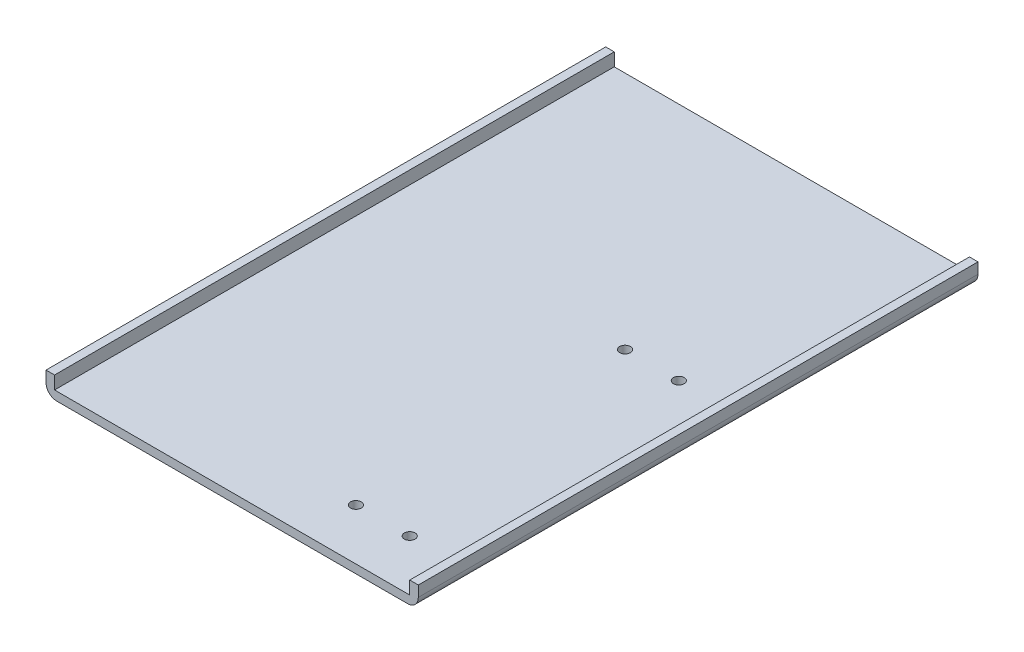
ISO-10303-21;
HEADER;
FILE_DESCRIPTION(('STEP AP214'),'2;1');
FILE_NAME('part.step','',(''),(''),'','','');
FILE_SCHEMA(('AUTOMOTIVE_DESIGN { 1 0 10303 214 1 1 1 1 }'));
ENDSEC;
DATA;
#1=APPLICATION_CONTEXT('core data for automotive mechanical design processes');
#2=APPLICATION_PROTOCOL_DEFINITION('international standard','automotive_design',2000,#1);
#3=PRODUCT_CONTEXT('',#1,'mechanical');
#4=PRODUCT('Part','Part','',(#3));
#5=PRODUCT_RELATED_PRODUCT_CATEGORY('part','',(#4));
#6=PRODUCT_DEFINITION_FORMATION('','',#4);
#7=PRODUCT_DEFINITION_CONTEXT('part definition',#1,'design');
#8=PRODUCT_DEFINITION('design','',#6,#7);
#9=PRODUCT_DEFINITION_SHAPE('','',#8);
#10=(LENGTH_UNIT() NAMED_UNIT(*) SI_UNIT(.MILLI.,.METRE.));
#11=(NAMED_UNIT(*) PLANE_ANGLE_UNIT() SI_UNIT($,.RADIAN.));
#12=(NAMED_UNIT(*) SI_UNIT($,.STERADIAN.) SOLID_ANGLE_UNIT());
#13=UNCERTAINTY_MEASURE_WITH_UNIT(LENGTH_MEASURE(1.E-05),#10,'distance_accuracy_value','');
#14=(GEOMETRIC_REPRESENTATION_CONTEXT(3) GLOBAL_UNCERTAINTY_ASSIGNED_CONTEXT((#13)) GLOBAL_UNIT_ASSIGNED_CONTEXT((#10,
#11,#12)) REPRESENTATION_CONTEXT('',''));
#15=CARTESIAN_POINT('',(0.,0.,0.));
#16=DIRECTION('',(0.,0.,1.));
#17=DIRECTION('',(1.,0.,0.));
#18=AXIS2_PLACEMENT_3D('',#15,#16,#17);
#19=CARTESIAN_POINT('',(-32.5875,2.,0.));
#20=DIRECTION('',(0.,0.,-1.));
#21=DIRECTION('',(-1.,0.,0.));
#22=AXIS2_PLACEMENT_3D('',#19,#20,#21);
#23=CYLINDRICAL_SURFACE('',#22,2.);
#24=DIRECTION('',(0.,0.,1.));
#25=VECTOR('',#24,1.);
#26=CARTESIAN_POINT('',(-34.5875,2.,0.));
#27=LINE('',#26,#25);
#28=CARTESIAN_POINT('',(-34.5875,2.,-52.));
#29=VERTEX_POINT('',#28);
#30=CARTESIAN_POINT('',(-34.5875,2.,52.));
#31=VERTEX_POINT('',#30);
#32=EDGE_CURVE('E213',#29,#31,#27,.T.);
#33=ORIENTED_EDGE('',*,*,#32,.F.);
#34=CARTESIAN_POINT('',(-32.5875,2.,-52.));
#35=DIRECTION('',(0.,0.,1.));
#36=DIRECTION('',(1.,0.,0.));
#37=AXIS2_PLACEMENT_3D('',#34,#35,#36);
#38=CIRCLE('',#37,2.);
#39=CARTESIAN_POINT('',(-32.5875,0.,-52.));
#40=VERTEX_POINT('',#39);
#41=EDGE_CURVE('E39',#40,#29,#38,.F.);
#42=ORIENTED_EDGE('',*,*,#41,.F.);
#43=DIRECTION('',(0.,0.,1.));
#44=VECTOR('',#43,1.);
#45=CARTESIAN_POINT('',(-32.5875,0.,0.));
#46=LINE('',#45,#44);
#47=CARTESIAN_POINT('',(-32.5875,0.,52.));
#48=VERTEX_POINT('',#47);
#49=EDGE_CURVE('E216',#48,#40,#46,.F.);
#50=ORIENTED_EDGE('',*,*,#49,.F.);
#51=CARTESIAN_POINT('',(-32.5875,2.,52.));
#52=DIRECTION('',(0.,0.,-1.));
#53=DIRECTION('',(-1.,0.,0.));
#54=AXIS2_PLACEMENT_3D('',#51,#52,#53);
#55=CIRCLE('',#54,2.);
#56=EDGE_CURVE('E11',#31,#48,#55,.F.);
#57=ORIENTED_EDGE('',*,*,#56,.F.);
#58=EDGE_LOOP('',(#33,#42,#50,#57));
#59=FACE_BOUND('',#58,.T.);
#60=ADVANCED_FACE('F32',(#59),#23,.T.);
#61=CARTESIAN_POINT('',(32.5875,2.,0.));
#62=DIRECTION('',(0.,0.,-1.));
#63=DIRECTION('',(-1.,0.,0.));
#64=AXIS2_PLACEMENT_3D('',#61,#62,#63);
#65=CYLINDRICAL_SURFACE('',#64,2.);
#66=DIRECTION('',(0.,0.,1.));
#67=VECTOR('',#66,1.);
#68=CARTESIAN_POINT('',(32.5875,0.,0.));
#69=LINE('',#68,#67);
#70=CARTESIAN_POINT('',(32.5875,0.,-52.));
#71=VERTEX_POINT('',#70);
#72=CARTESIAN_POINT('',(32.5875,0.,52.));
#73=VERTEX_POINT('',#72);
#74=EDGE_CURVE('E193',#71,#73,#69,.T.);
#75=ORIENTED_EDGE('',*,*,#74,.F.);
#76=CARTESIAN_POINT('',(32.5875,2.,-52.));
#77=DIRECTION('',(0.,0.,1.));
#78=DIRECTION('',(1.,0.,0.));
#79=AXIS2_PLACEMENT_3D('',#76,#77,#78);
#80=CIRCLE('',#79,2.);
#81=CARTESIAN_POINT('',(34.5875,2.,-52.));
#82=VERTEX_POINT('',#81);
#83=EDGE_CURVE('E209',#82,#71,#80,.F.);
#84=ORIENTED_EDGE('',*,*,#83,.F.);
#85=DIRECTION('',(0.,0.,1.));
#86=VECTOR('',#85,1.);
#87=CARTESIAN_POINT('',(34.5875,2.,0.));
#88=LINE('',#87,#86);
#89=CARTESIAN_POINT('',(34.5875,2.,52.));
#90=VERTEX_POINT('',#89);
#91=EDGE_CURVE('E113',#90,#82,#88,.F.);
#92=ORIENTED_EDGE('',*,*,#91,.F.);
#93=CARTESIAN_POINT('',(32.5875,2.,52.));
#94=DIRECTION('',(0.,0.,-1.));
#95=DIRECTION('',(-1.,0.,0.));
#96=AXIS2_PLACEMENT_3D('',#93,#94,#95);
#97=CIRCLE('',#96,2.);
#98=EDGE_CURVE('E211',#73,#90,#97,.F.);
#99=ORIENTED_EDGE('',*,*,#98,.F.);
#100=EDGE_LOOP('',(#75,#84,#92,#99));
#101=FACE_BOUND('',#100,.T.);
#102=ADVANCED_FACE('F277',(#101),#65,.T.);
#103=CARTESIAN_POINT('',(-33.,1.5875,-52.));
#104=DIRECTION('',(0.,0.,1.));
#105=DIRECTION('',(1.,0.,0.));
#106=AXIS2_PLACEMENT_3D('',#103,#104,#105);
#107=PLANE('',#106);
#108=DIRECTION('',(-1.,0.,0.));
#109=VECTOR('',#108,1.);
#110=CARTESIAN_POINT('',(-33.,0.,-52.));
#111=LINE('',#110,#109);
#112=EDGE_CURVE('E169',#71,#40,#111,.T.);
#113=ORIENTED_EDGE('',*,*,#112,.T.);
#114=ORIENTED_EDGE('',*,*,#41,.T.);
#115=DIRECTION('',(0.,1.,0.));
#116=VECTOR('',#115,1.);
#117=CARTESIAN_POINT('',(-34.5875,0.,-52.));
#118=LINE('',#117,#116);
#119=CARTESIAN_POINT('',(-34.5875,4.,-52.));
#120=VERTEX_POINT('',#119);
#121=EDGE_CURVE('E146',#29,#120,#118,.T.);
#122=ORIENTED_EDGE('',*,*,#121,.T.);
#123=DIRECTION('',(1.,0.,0.));
#124=VECTOR('',#123,1.);
#125=CARTESIAN_POINT('',(-34.5875,4.,-52.));
#126=LINE('',#125,#124);
#127=CARTESIAN_POINT('',(-33.,4.,-52.));
#128=VERTEX_POINT('',#127);
#129=EDGE_CURVE('E154',#120,#128,#126,.T.);
#130=ORIENTED_EDGE('',*,*,#129,.T.);
#131=DIRECTION('',(0.,1.,0.));
#132=VECTOR('',#131,1.);
#133=CARTESIAN_POINT('',(-33.,0.,-52.));
#134=LINE('',#133,#132);
#135=CARTESIAN_POINT('',(-33.,1.5875,-52.));
#136=VERTEX_POINT('',#135);
#137=EDGE_CURVE('E125',#136,#128,#134,.T.);
#138=ORIENTED_EDGE('',*,*,#137,.F.);
#139=DIRECTION('',(-1.,0.,0.));
#140=VECTOR('',#139,1.);
#141=CARTESIAN_POINT('',(-33.,1.5875,-52.));
#142=LINE('',#141,#140);
#143=CARTESIAN_POINT('',(33.,1.5875,-52.));
#144=VERTEX_POINT('',#143);
#145=EDGE_CURVE('E191',#144,#136,#142,.T.);
#146=ORIENTED_EDGE('',*,*,#145,.F.);
#147=DIRECTION('',(0.,1.,0.));
#148=VECTOR('',#147,1.);
#149=CARTESIAN_POINT('',(33.,0.,-52.));
#150=LINE('',#149,#148);
#151=CARTESIAN_POINT('',(33.,4.,-52.));
#152=VERTEX_POINT('',#151);
#153=EDGE_CURVE('E122',#144,#152,#150,.T.);
#154=ORIENTED_EDGE('',*,*,#153,.T.);
#155=DIRECTION('',(-1.,0.,0.));
#156=VECTOR('',#155,1.);
#157=CARTESIAN_POINT('',(34.5875,4.,-52.));
#158=LINE('',#157,#156);
#159=CARTESIAN_POINT('',(34.5875,4.,-52.));
#160=VERTEX_POINT('',#159);
#161=EDGE_CURVE('E118',#160,#152,#158,.T.);
#162=ORIENTED_EDGE('',*,*,#161,.F.);
#163=DIRECTION('',(0.,1.,0.));
#164=VECTOR('',#163,1.);
#165=CARTESIAN_POINT('',(34.5875,0.,-52.));
#166=LINE('',#165,#164);
#167=EDGE_CURVE('E105',#82,#160,#166,.T.);
#168=ORIENTED_EDGE('',*,*,#167,.F.);
#169=ORIENTED_EDGE('',*,*,#83,.T.);
#170=EDGE_LOOP('',(#113,#114,#122,#130,#138,#146,#154,#162,#168,#169));
#171=FACE_BOUND('',#170,.T.);
#172=ADVANCED_FACE('F120',(#171),#107,.F.);
#173=CARTESIAN_POINT('',(-33.,1.5875,52.));
#174=DIRECTION('',(0.,0.,-1.));
#175=DIRECTION('',(-1.,0.,0.));
#176=AXIS2_PLACEMENT_3D('',#173,#174,#175);
#177=PLANE('',#176);
#178=DIRECTION('',(0.,1.,0.));
#179=VECTOR('',#178,1.);
#180=CARTESIAN_POINT('',(-34.5875,0.,52.));
#181=LINE('',#180,#179);
#182=CARTESIAN_POINT('',(-34.5875,4.,52.));
#183=VERTEX_POINT('',#182);
#184=EDGE_CURVE('E152',#31,#183,#181,.T.);
#185=ORIENTED_EDGE('',*,*,#184,.F.);
#186=ORIENTED_EDGE('',*,*,#56,.T.);
#187=DIRECTION('',(1.,0.,0.));
#188=VECTOR('',#187,1.);
#189=CARTESIAN_POINT('',(-33.,0.,52.));
#190=LINE('',#189,#188);
#191=EDGE_CURVE('E174',#48,#73,#190,.T.);
#192=ORIENTED_EDGE('',*,*,#191,.T.);
#193=ORIENTED_EDGE('',*,*,#98,.T.);
#194=DIRECTION('',(0.,-1.,0.));
#195=VECTOR('',#194,1.);
#196=CARTESIAN_POINT('',(34.5875,0.,52.));
#197=LINE('',#196,#195);
#198=CARTESIAN_POINT('',(34.5875,4.,52.));
#199=VERTEX_POINT('',#198);
#200=EDGE_CURVE('E115',#199,#90,#197,.T.);
#201=ORIENTED_EDGE('',*,*,#200,.F.);
#202=DIRECTION('',(-1.,0.,0.));
#203=VECTOR('',#202,1.);
#204=CARTESIAN_POINT('',(34.5875,4.,52.));
#205=LINE('',#204,#203);
#206=CARTESIAN_POINT('',(33.,4.,52.));
#207=VERTEX_POINT('',#206);
#208=EDGE_CURVE('E126',#199,#207,#205,.T.);
#209=ORIENTED_EDGE('',*,*,#208,.T.);
#210=DIRECTION('',(0.,-1.,0.));
#211=VECTOR('',#210,1.);
#212=CARTESIAN_POINT('',(33.,0.,52.));
#213=LINE('',#212,#211);
#214=CARTESIAN_POINT('',(33.,1.5875,52.));
#215=VERTEX_POINT('',#214);
#216=EDGE_CURVE('E140',#207,#215,#213,.T.);
#217=ORIENTED_EDGE('',*,*,#216,.T.);
#218=DIRECTION('',(1.,0.,0.));
#219=VECTOR('',#218,1.);
#220=CARTESIAN_POINT('',(-33.,1.5875,52.));
#221=LINE('',#220,#219);
#222=CARTESIAN_POINT('',(-33.,1.5875,52.));
#223=VERTEX_POINT('',#222);
#224=EDGE_CURVE('E190',#223,#215,#221,.T.);
#225=ORIENTED_EDGE('',*,*,#224,.F.);
#226=DIRECTION('',(0.,1.,0.));
#227=VECTOR('',#226,1.);
#228=CARTESIAN_POINT('',(-33.,0.,52.));
#229=LINE('',#228,#227);
#230=CARTESIAN_POINT('',(-33.,4.,52.));
#231=VERTEX_POINT('',#230);
#232=EDGE_CURVE('E149',#223,#231,#229,.T.);
#233=ORIENTED_EDGE('',*,*,#232,.T.);
#234=DIRECTION('',(1.,0.,0.));
#235=VECTOR('',#234,1.);
#236=CARTESIAN_POINT('',(-34.5875,4.,52.));
#237=LINE('',#236,#235);
#238=EDGE_CURVE('E167',#183,#231,#237,.T.);
#239=ORIENTED_EDGE('',*,*,#238,.F.);
#240=EDGE_LOOP('',(#185,#186,#192,#193,#201,#209,#217,#225,#233,#239));
#241=FACE_BOUND('',#240,.T.);
#242=ADVANCED_FACE('F220',(#241),#177,.F.);
#243=CARTESIAN_POINT('',(0.,1.5875,0.));
#244=DIRECTION('',(0.,-1.,0.));
#245=DIRECTION('',(0.,0.,-1.));
#246=AXIS2_PLACEMENT_3D('',#243,#244,#245);
#247=PLANE('',#246);
#248=CARTESIAN_POINT('',(23.5,1.5875,42.5));
#249=DIRECTION('',(0.,1.,0.));
#250=DIRECTION('',(0.,0.,1.));
#251=AXIS2_PLACEMENT_3D('',#248,#249,#250);
#252=CIRCLE('',#251,1.);
#253=CARTESIAN_POINT('',(23.5,1.5875,43.5));
#254=VERTEX_POINT('',#253);
#255=EDGE_CURVE('E241',#254,#254,#252,.T.);
#256=ORIENTED_EDGE('',*,*,#255,.F.);
#257=EDGE_LOOP('',(#256));
#258=FACE_BOUND('',#257,.T.);
#259=CARTESIAN_POINT('',(13.5,1.5875,42.5));
#260=DIRECTION('',(0.,1.,0.));
#261=DIRECTION('',(0.,0.,1.));
#262=AXIS2_PLACEMENT_3D('',#259,#260,#261);
#263=CIRCLE('',#262,1.);
#264=CARTESIAN_POINT('',(13.5,1.5875,43.5));
#265=VERTEX_POINT('',#264);
#266=EDGE_CURVE('E235',#265,#265,#263,.T.);
#267=ORIENTED_EDGE('',*,*,#266,.F.);
#268=EDGE_LOOP('',(#267));
#269=FACE_BOUND('',#268,.T.);
#270=CARTESIAN_POINT('',(23.5,1.5875,-7.49999999999999));
#271=DIRECTION('',(0.,1.,0.));
#272=DIRECTION('',(0.,0.,1.));
#273=AXIS2_PLACEMENT_3D('',#270,#271,#272);
#274=CIRCLE('',#273,1.);
#275=CARTESIAN_POINT('',(23.5,1.5875,-6.49999999999999));
#276=VERTEX_POINT('',#275);
#277=EDGE_CURVE('E229',#276,#276,#274,.T.);
#278=ORIENTED_EDGE('',*,*,#277,.F.);
#279=EDGE_LOOP('',(#278));
#280=FACE_BOUND('',#279,.T.);
#281=CARTESIAN_POINT('',(13.5,1.5875,-7.49999999999999));
#282=DIRECTION('',(0.,1.,0.));
#283=DIRECTION('',(0.,0.,1.));
#284=AXIS2_PLACEMENT_3D('',#281,#282,#283);
#285=CIRCLE('',#284,1.);
#286=CARTESIAN_POINT('',(13.5,1.5875,-6.49999999999999));
#287=VERTEX_POINT('',#286);
#288=EDGE_CURVE('E226',#287,#287,#285,.T.);
#289=ORIENTED_EDGE('',*,*,#288,.F.);
#290=EDGE_LOOP('',(#289));
#291=FACE_BOUND('',#290,.T.);
#292=DIRECTION('',(0.,0.,-1.));
#293=VECTOR('',#292,1.);
#294=CARTESIAN_POINT('',(33.,1.5875,52.));
#295=LINE('',#294,#293);
#296=EDGE_CURVE('E195',#215,#144,#295,.T.);
#297=ORIENTED_EDGE('',*,*,#296,.T.);
#298=ORIENTED_EDGE('',*,*,#145,.T.);
#299=DIRECTION('',(0.,0.,1.));
#300=VECTOR('',#299,1.);
#301=CARTESIAN_POINT('',(-33.,1.5875,52.));
#302=LINE('',#301,#300);
#303=EDGE_CURVE('E186',#136,#223,#302,.T.);
#304=ORIENTED_EDGE('',*,*,#303,.T.);
#305=ORIENTED_EDGE('',*,*,#224,.T.);
#306=EDGE_LOOP('',(#297,#298,#304,#305));
#307=FACE_BOUND('',#306,.T.);
#308=ADVANCED_FACE('F222',(#258,#269,#280,#291,#307),#247,.F.);
#309=CARTESIAN_POINT('',(0.,0.,0.));
#310=DIRECTION('',(0.,-1.,0.));
#311=DIRECTION('',(0.,0.,-1.));
#312=AXIS2_PLACEMENT_3D('',#309,#310,#311);
#313=PLANE('',#312);
#314=CARTESIAN_POINT('',(23.5,0.,42.5));
#315=DIRECTION('',(0.,1.,0.));
#316=DIRECTION('',(0.,0.,1.));
#317=AXIS2_PLACEMENT_3D('',#314,#315,#316);
#318=CIRCLE('',#317,1.);
#319=CARTESIAN_POINT('',(23.5,0.,43.5));
#320=VERTEX_POINT('',#319);
#321=EDGE_CURVE('E244',#320,#320,#318,.T.);
#322=ORIENTED_EDGE('',*,*,#321,.T.);
#323=EDGE_LOOP('',(#322));
#324=FACE_BOUND('',#323,.T.);
#325=CARTESIAN_POINT('',(13.5,0.,42.5));
#326=DIRECTION('',(0.,1.,0.));
#327=DIRECTION('',(0.,0.,1.));
#328=AXIS2_PLACEMENT_3D('',#325,#326,#327);
#329=CIRCLE('',#328,1.);
#330=CARTESIAN_POINT('',(13.5,0.,43.5));
#331=VERTEX_POINT('',#330);
#332=EDGE_CURVE('E238',#331,#331,#329,.T.);
#333=ORIENTED_EDGE('',*,*,#332,.T.);
#334=EDGE_LOOP('',(#333));
#335=FACE_BOUND('',#334,.T.);
#336=CARTESIAN_POINT('',(23.5,0.,-7.49999999999999));
#337=DIRECTION('',(0.,1.,0.));
#338=DIRECTION('',(0.,0.,1.));
#339=AXIS2_PLACEMENT_3D('',#336,#337,#338);
#340=CIRCLE('',#339,1.);
#341=CARTESIAN_POINT('',(23.5,0.,-6.49999999999999));
#342=VERTEX_POINT('',#341);
#343=EDGE_CURVE('E232',#342,#342,#340,.T.);
#344=ORIENTED_EDGE('',*,*,#343,.T.);
#345=EDGE_LOOP('',(#344));
#346=FACE_BOUND('',#345,.T.);
#347=CARTESIAN_POINT('',(13.5,0.,-7.49999999999999));
#348=DIRECTION('',(0.,1.,0.));
#349=DIRECTION('',(0.,0.,1.));
#350=AXIS2_PLACEMENT_3D('',#347,#348,#349);
#351=CIRCLE('',#350,1.);
#352=CARTESIAN_POINT('',(13.5,0.,-6.49999999999999));
#353=VERTEX_POINT('',#352);
#354=EDGE_CURVE('E143',#353,#353,#351,.T.);
#355=ORIENTED_EDGE('',*,*,#354,.T.);
#356=EDGE_LOOP('',(#355));
#357=FACE_BOUND('',#356,.T.);
#358=ORIENTED_EDGE('',*,*,#191,.F.);
#359=ORIENTED_EDGE('',*,*,#49,.T.);
#360=ORIENTED_EDGE('',*,*,#112,.F.);
#361=ORIENTED_EDGE('',*,*,#74,.T.);
#362=EDGE_LOOP('',(#358,#359,#360,#361));
#363=FACE_BOUND('',#362,.T.);
#364=ADVANCED_FACE('F254',(#324,#335,#346,#357,#363),#313,.T.);
#365=CARTESIAN_POINT('',(-33.,0.,0.));
#366=DIRECTION('',(1.,0.,0.));
#367=DIRECTION('',(0.,0.,-1.));
#368=AXIS2_PLACEMENT_3D('',#365,#366,#367);
#369=PLANE('',#368);
#370=ORIENTED_EDGE('',*,*,#303,.F.);
#371=ORIENTED_EDGE('',*,*,#137,.T.);
#372=DIRECTION('',(0.,0.,1.));
#373=VECTOR('',#372,1.);
#374=CARTESIAN_POINT('',(-33.,4.,-52.));
#375=LINE('',#374,#373);
#376=EDGE_CURVE('E157',#128,#231,#375,.T.);
#377=ORIENTED_EDGE('',*,*,#376,.T.);
#378=ORIENTED_EDGE('',*,*,#232,.F.);
#379=EDGE_LOOP('',(#370,#371,#377,#378));
#380=FACE_BOUND('',#379,.T.);
#381=ADVANCED_FACE('F184',(#380),#369,.T.);
#382=CARTESIAN_POINT('',(-34.5875,4.,-52.));
#383=DIRECTION('',(0.,1.,0.));
#384=DIRECTION('',(0.,0.,1.));
#385=AXIS2_PLACEMENT_3D('',#382,#383,#384);
#386=PLANE('',#385);
#387=ORIENTED_EDGE('',*,*,#376,.F.);
#388=ORIENTED_EDGE('',*,*,#129,.F.);
#389=DIRECTION('',(0.,0.,1.));
#390=VECTOR('',#389,1.);
#391=CARTESIAN_POINT('',(-34.5875,4.,-52.));
#392=LINE('',#391,#390);
#393=EDGE_CURVE('E148',#120,#183,#392,.T.);
#394=ORIENTED_EDGE('',*,*,#393,.T.);
#395=ORIENTED_EDGE('',*,*,#238,.T.);
#396=EDGE_LOOP('',(#387,#388,#394,#395));
#397=FACE_BOUND('',#396,.T.);
#398=ADVANCED_FACE('F182',(#397),#386,.T.);
#399=CARTESIAN_POINT('',(-34.5875,0.,0.));
#400=DIRECTION('',(1.,0.,0.));
#401=DIRECTION('',(0.,0.,-1.));
#402=AXIS2_PLACEMENT_3D('',#399,#400,#401);
#403=PLANE('',#402);
#404=ORIENTED_EDGE('',*,*,#121,.F.);
#405=ORIENTED_EDGE('',*,*,#32,.T.);
#406=ORIENTED_EDGE('',*,*,#184,.T.);
#407=ORIENTED_EDGE('',*,*,#393,.F.);
#408=EDGE_LOOP('',(#404,#405,#406,#407));
#409=FACE_BOUND('',#408,.T.);
#410=ADVANCED_FACE('F219',(#409),#403,.F.);
#411=CARTESIAN_POINT('',(33.,0.,0.));
#412=DIRECTION('',(-1.,0.,0.));
#413=DIRECTION('',(0.,0.,1.));
#414=AXIS2_PLACEMENT_3D('',#411,#412,#413);
#415=PLANE('',#414);
#416=ORIENTED_EDGE('',*,*,#296,.F.);
#417=ORIENTED_EDGE('',*,*,#216,.F.);
#418=DIRECTION('',(0.,0.,1.));
#419=VECTOR('',#418,1.);
#420=CARTESIAN_POINT('',(33.,4.,52.));
#421=LINE('',#420,#419);
#422=EDGE_CURVE('E145',#152,#207,#421,.T.);
#423=ORIENTED_EDGE('',*,*,#422,.F.);
#424=ORIENTED_EDGE('',*,*,#153,.F.);
#425=EDGE_LOOP('',(#416,#417,#423,#424));
#426=FACE_BOUND('',#425,.T.);
#427=ADVANCED_FACE('F224',(#426),#415,.T.);
#428=CARTESIAN_POINT('',(34.5875,4.,52.));
#429=DIRECTION('',(0.,-1.,0.));
#430=DIRECTION('',(0.,0.,-1.));
#431=AXIS2_PLACEMENT_3D('',#428,#429,#430);
#432=PLANE('',#431);
#433=ORIENTED_EDGE('',*,*,#422,.T.);
#434=ORIENTED_EDGE('',*,*,#208,.F.);
#435=DIRECTION('',(0.,0.,1.));
#436=VECTOR('',#435,1.);
#437=CARTESIAN_POINT('',(34.5875,4.,52.));
#438=LINE('',#437,#436);
#439=EDGE_CURVE('E110',#160,#199,#438,.T.);
#440=ORIENTED_EDGE('',*,*,#439,.F.);
#441=ORIENTED_EDGE('',*,*,#161,.T.);
#442=EDGE_LOOP('',(#433,#434,#440,#441));
#443=FACE_BOUND('',#442,.T.);
#444=ADVANCED_FACE('F128',(#443),#432,.F.);
#445=CARTESIAN_POINT('',(34.5875,0.,0.));
#446=DIRECTION('',(-1.,0.,0.));
#447=DIRECTION('',(0.,0.,1.));
#448=AXIS2_PLACEMENT_3D('',#445,#446,#447);
#449=PLANE('',#448);
#450=ORIENTED_EDGE('',*,*,#200,.T.);
#451=ORIENTED_EDGE('',*,*,#91,.T.);
#452=ORIENTED_EDGE('',*,*,#167,.T.);
#453=ORIENTED_EDGE('',*,*,#439,.T.);
#454=EDGE_LOOP('',(#450,#451,#452,#453));
#455=FACE_BOUND('',#454,.T.);
#456=ADVANCED_FACE('F108',(#455),#449,.F.);
#457=CARTESIAN_POINT('',(13.5,0.,-7.49999999999999));
#458=DIRECTION('',(0.,1.,0.));
#459=DIRECTION('',(0.,0.,1.));
#460=AXIS2_PLACEMENT_3D('',#457,#458,#459);
#461=CYLINDRICAL_SURFACE('',#460,1.);
#462=ORIENTED_EDGE('',*,*,#354,.F.);
#463=EDGE_LOOP('',(#462));
#464=FACE_BOUND('',#463,.T.);
#465=ORIENTED_EDGE('',*,*,#288,.T.);
#466=EDGE_LOOP('',(#465));
#467=FACE_BOUND('',#466,.T.);
#468=ADVANCED_FACE('F262',(#464,#467),#461,.F.);
#469=CARTESIAN_POINT('',(23.5,0.,-7.49999999999999));
#470=DIRECTION('',(0.,1.,0.));
#471=DIRECTION('',(0.,0.,1.));
#472=AXIS2_PLACEMENT_3D('',#469,#470,#471);
#473=CYLINDRICAL_SURFACE('',#472,1.);
#474=ORIENTED_EDGE('',*,*,#343,.F.);
#475=EDGE_LOOP('',(#474));
#476=FACE_BOUND('',#475,.T.);
#477=ORIENTED_EDGE('',*,*,#277,.T.);
#478=EDGE_LOOP('',(#477));
#479=FACE_BOUND('',#478,.T.);
#480=ADVANCED_FACE('F264',(#476,#479),#473,.F.);
#481=CARTESIAN_POINT('',(13.5,0.,42.5));
#482=DIRECTION('',(0.,1.,0.));
#483=DIRECTION('',(0.,0.,1.));
#484=AXIS2_PLACEMENT_3D('',#481,#482,#483);
#485=CYLINDRICAL_SURFACE('',#484,1.);
#486=ORIENTED_EDGE('',*,*,#332,.F.);
#487=EDGE_LOOP('',(#486));
#488=FACE_BOUND('',#487,.T.);
#489=ORIENTED_EDGE('',*,*,#266,.T.);
#490=EDGE_LOOP('',(#489));
#491=FACE_BOUND('',#490,.T.);
#492=ADVANCED_FACE('F271',(#488,#491),#485,.F.);
#493=CARTESIAN_POINT('',(23.5,0.,42.5));
#494=DIRECTION('',(0.,1.,0.));
#495=DIRECTION('',(0.,0.,1.));
#496=AXIS2_PLACEMENT_3D('',#493,#494,#495);
#497=CYLINDRICAL_SURFACE('',#496,1.);
#498=ORIENTED_EDGE('',*,*,#321,.F.);
#499=EDGE_LOOP('',(#498));
#500=FACE_BOUND('',#499,.T.);
#501=ORIENTED_EDGE('',*,*,#255,.T.);
#502=EDGE_LOOP('',(#501));
#503=FACE_BOUND('',#502,.T.);
#504=ADVANCED_FACE('F250',(#500,#503),#497,.F.);
#505=CLOSED_SHELL('',(#60,#102,#172,#242,#308,#364,#381,#398,#410,#427,#444,#456,#468,#480,#492,#504));
#506=MANIFOLD_SOLID_BREP('B2',#505);
#507=ADVANCED_BREP_SHAPE_REPRESENTATION('',(#18,#506),#14);
#508=SHAPE_DEFINITION_REPRESENTATION(#9,#507);
ENDSEC;
END-ISO-10303-21;
